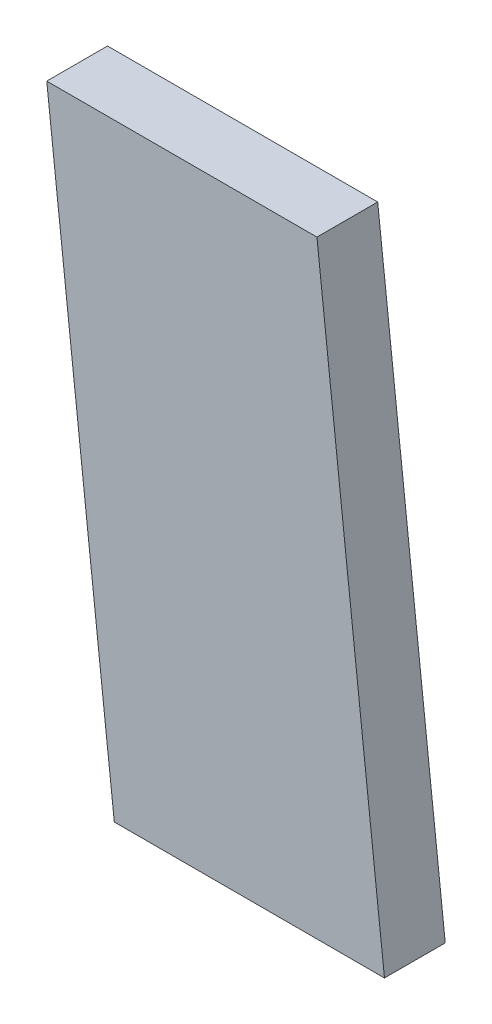
ISO-10303-21;
HEADER;
FILE_DESCRIPTION(('STEP AP214'),'2;1');
FILE_NAME('part.step','',(''),(''),'','','');
FILE_SCHEMA(('AUTOMOTIVE_DESIGN { 1 0 10303 214 1 1 1 1 }'));
ENDSEC;
DATA;
#1=APPLICATION_CONTEXT('core data for automotive mechanical design processes');
#2=APPLICATION_PROTOCOL_DEFINITION('international standard','automotive_design',2000,#1);
#3=PRODUCT_CONTEXT('',#1,'mechanical');
#4=PRODUCT('Part','Part','',(#3));
#5=PRODUCT_RELATED_PRODUCT_CATEGORY('part','',(#4));
#6=PRODUCT_DEFINITION_FORMATION('','',#4);
#7=PRODUCT_DEFINITION_CONTEXT('part definition',#1,'design');
#8=PRODUCT_DEFINITION('design','',#6,#7);
#9=PRODUCT_DEFINITION_SHAPE('','',#8);
#10=(LENGTH_UNIT() NAMED_UNIT(*) SI_UNIT(.MILLI.,.METRE.));
#11=(NAMED_UNIT(*) PLANE_ANGLE_UNIT() SI_UNIT($,.RADIAN.));
#12=(NAMED_UNIT(*) SI_UNIT($,.STERADIAN.) SOLID_ANGLE_UNIT());
#13=UNCERTAINTY_MEASURE_WITH_UNIT(LENGTH_MEASURE(1.E-05),#10,'distance_accuracy_value','');
#14=(GEOMETRIC_REPRESENTATION_CONTEXT(3) GLOBAL_UNCERTAINTY_ASSIGNED_CONTEXT((#13)) GLOBAL_UNIT_ASSIGNED_CONTEXT((#10,
#11,#12)) REPRESENTATION_CONTEXT('',''));
#15=CARTESIAN_POINT('',(0.,0.,0.));
#16=DIRECTION('',(0.,0.,1.));
#17=DIRECTION('',(1.,0.,0.));
#18=AXIS2_PLACEMENT_3D('',#15,#16,#17);
#19=CARTESIAN_POINT('',(1380.,500.,18.));
#20=DIRECTION('',(0.,1.,0.));
#21=DIRECTION('',(0.,0.,1.));
#22=AXIS2_PLACEMENT_3D('',#19,#20,#21);
#23=PLANE('',#22);
#24=DIRECTION('',(1.,0.,0.));
#25=VECTOR('',#24,1.);
#26=CARTESIAN_POINT('',(1380.,500.,0.));
#27=LINE('',#26,#25);
#28=CARTESIAN_POINT('',(1300.,500.,0.));
#29=VERTEX_POINT('',#28);
#30=CARTESIAN_POINT('',(1380.,500.,0.));
#31=VERTEX_POINT('',#30);
#32=EDGE_CURVE('E105',#29,#31,#27,.T.);
#33=ORIENTED_EDGE('',*,*,#32,.T.);
#34=DIRECTION('',(0.,0.,-1.));
#35=VECTOR('',#34,1.);
#36=CARTESIAN_POINT('',(1380.,500.,18.));
#37=LINE('',#36,#35);
#38=CARTESIAN_POINT('',(1380.,500.,18.));
#39=VERTEX_POINT('',#38);
#40=EDGE_CURVE('E11',#39,#31,#37,.T.);
#41=ORIENTED_EDGE('',*,*,#40,.F.);
#42=DIRECTION('',(1.,0.,0.));
#43=VECTOR('',#42,1.);
#44=CARTESIAN_POINT('',(1380.,500.,18.));
#45=LINE('',#44,#43);
#46=CARTESIAN_POINT('',(1300.,500.,18.));
#47=VERTEX_POINT('',#46);
#48=EDGE_CURVE('E89',#47,#39,#45,.T.);
#49=ORIENTED_EDGE('',*,*,#48,.F.);
#50=DIRECTION('',(0.,0.,-1.));
#51=VECTOR('',#50,1.);
#52=CARTESIAN_POINT('',(1300.,500.,18.));
#53=LINE('',#52,#51);
#54=EDGE_CURVE('E97',#47,#29,#53,.T.);
#55=ORIENTED_EDGE('',*,*,#54,.T.);
#56=EDGE_LOOP('',(#33,#41,#49,#55));
#57=FACE_BOUND('',#56,.T.);
#58=ADVANCED_FACE('F39',(#57),#23,.F.);
#59=CARTESIAN_POINT('',(1360.,680.,18.));
#60=DIRECTION('',(-0.993883734673619,-0.110431526074845,0.));
#61=DIRECTION('',(0.110431526074845,-0.993883734673619,0.));
#62=AXIS2_PLACEMENT_3D('',#59,#60,#61);
#63=PLANE('',#62);
#64=DIRECTION('',(-0.110431526074845,0.993883734673619,0.));
#65=VECTOR('',#64,1.);
#66=CARTESIAN_POINT('',(1360.,680.,0.));
#67=LINE('',#66,#65);
#68=CARTESIAN_POINT('',(1360.,680.,0.));
#69=VERTEX_POINT('',#68);
#70=EDGE_CURVE('E92',#31,#69,#67,.T.);
#71=ORIENTED_EDGE('',*,*,#70,.T.);
#72=DIRECTION('',(0.,0.,-1.));
#73=VECTOR('',#72,1.);
#74=CARTESIAN_POINT('',(1360.,680.,18.));
#75=LINE('',#74,#73);
#76=CARTESIAN_POINT('',(1360.,680.,18.));
#77=VERTEX_POINT('',#76);
#78=EDGE_CURVE('E50',#77,#69,#75,.T.);
#79=ORIENTED_EDGE('',*,*,#78,.F.);
#80=DIRECTION('',(-0.110431526074845,0.993883734673619,0.));
#81=VECTOR('',#80,1.);
#82=CARTESIAN_POINT('',(1360.,680.,18.));
#83=LINE('',#82,#81);
#84=EDGE_CURVE('E82',#39,#77,#83,.T.);
#85=ORIENTED_EDGE('',*,*,#84,.F.);
#86=ORIENTED_EDGE('',*,*,#40,.T.);
#87=EDGE_LOOP('',(#71,#79,#85,#86));
#88=FACE_BOUND('',#87,.T.);
#89=ADVANCED_FACE('F93',(#88),#63,.F.);
#90=CARTESIAN_POINT('',(1280.,680.,18.));
#91=DIRECTION('',(0.,-1.,0.));
#92=DIRECTION('',(0.,0.,-1.));
#93=AXIS2_PLACEMENT_3D('',#90,#91,#92);
#94=PLANE('',#93);
#95=DIRECTION('',(-1.,0.,0.));
#96=VECTOR('',#95,1.);
#97=CARTESIAN_POINT('',(1280.,680.,0.));
#98=LINE('',#97,#96);
#99=CARTESIAN_POINT('',(1280.,680.,0.));
#100=VERTEX_POINT('',#99);
#101=EDGE_CURVE('E72',#69,#100,#98,.T.);
#102=ORIENTED_EDGE('',*,*,#101,.T.);
#103=DIRECTION('',(0.,0.,-1.));
#104=VECTOR('',#103,1.);
#105=CARTESIAN_POINT('',(1280.,680.,18.));
#106=LINE('',#105,#104);
#107=CARTESIAN_POINT('',(1280.,680.,18.));
#108=VERTEX_POINT('',#107);
#109=EDGE_CURVE('E94',#108,#100,#106,.T.);
#110=ORIENTED_EDGE('',*,*,#109,.F.);
#111=DIRECTION('',(-1.,0.,0.));
#112=VECTOR('',#111,1.);
#113=CARTESIAN_POINT('',(1280.,680.,18.));
#114=LINE('',#113,#112);
#115=EDGE_CURVE('E88',#77,#108,#114,.T.);
#116=ORIENTED_EDGE('',*,*,#115,.F.);
#117=ORIENTED_EDGE('',*,*,#78,.T.);
#118=EDGE_LOOP('',(#102,#110,#116,#117));
#119=FACE_BOUND('',#118,.T.);
#120=ADVANCED_FACE('F96',(#119),#94,.F.);
#121=CARTESIAN_POINT('',(1300.,500.,18.));
#122=DIRECTION('',(0.993883734673619,0.110431526074847,0.));
#123=DIRECTION('',(-0.110431526074847,0.993883734673619,0.));
#124=AXIS2_PLACEMENT_3D('',#121,#122,#123);
#125=PLANE('',#124);
#126=DIRECTION('',(0.110431526074847,-0.993883734673619,0.));
#127=VECTOR('',#126,1.);
#128=CARTESIAN_POINT('',(1300.,500.,0.));
#129=LINE('',#128,#127);
#130=EDGE_CURVE('E76',#100,#29,#129,.T.);
#131=ORIENTED_EDGE('',*,*,#130,.T.);
#132=ORIENTED_EDGE('',*,*,#54,.F.);
#133=DIRECTION('',(0.110431526074847,-0.993883734673619,0.));
#134=VECTOR('',#133,1.);
#135=CARTESIAN_POINT('',(1300.,500.,18.));
#136=LINE('',#135,#134);
#137=EDGE_CURVE('E54',#108,#47,#136,.T.);
#138=ORIENTED_EDGE('',*,*,#137,.F.);
#139=ORIENTED_EDGE('',*,*,#109,.T.);
#140=EDGE_LOOP('',(#131,#132,#138,#139));
#141=FACE_BOUND('',#140,.T.);
#142=ADVANCED_FACE('F108',(#141),#125,.F.);
#143=CARTESIAN_POINT('',(0.,0.,18.));
#144=DIRECTION('',(0.,0.,-1.));
#145=DIRECTION('',(-1.,0.,0.));
#146=AXIS2_PLACEMENT_3D('',#143,#144,#145);
#147=PLANE('',#146);
#148=ORIENTED_EDGE('',*,*,#48,.T.);
#149=ORIENTED_EDGE('',*,*,#84,.T.);
#150=ORIENTED_EDGE('',*,*,#115,.T.);
#151=ORIENTED_EDGE('',*,*,#137,.T.);
#152=EDGE_LOOP('',(#148,#149,#150,#151));
#153=FACE_BOUND('',#152,.T.);
#154=ADVANCED_FACE('F86',(#153),#147,.F.);
#155=CARTESIAN_POINT('',(0.,0.,0.));
#156=DIRECTION('',(0.,0.,-1.));
#157=DIRECTION('',(-1.,0.,0.));
#158=AXIS2_PLACEMENT_3D('',#155,#156,#157);
#159=PLANE('',#158);
#160=ORIENTED_EDGE('',*,*,#32,.F.);
#161=ORIENTED_EDGE('',*,*,#130,.F.);
#162=ORIENTED_EDGE('',*,*,#101,.F.);
#163=ORIENTED_EDGE('',*,*,#70,.F.);
#164=EDGE_LOOP('',(#160,#161,#162,#163));
#165=FACE_BOUND('',#164,.T.);
#166=ADVANCED_FACE('F115',(#165),#159,.T.);
#167=CLOSED_SHELL('',(#58,#89,#120,#142,#154,#166));
#168=MANIFOLD_SOLID_BREP('B2',#167);
#169=ADVANCED_BREP_SHAPE_REPRESENTATION('',(#18,#168),#14);
#170=SHAPE_DEFINITION_REPRESENTATION(#9,#169);
ENDSEC;
END-ISO-10303-21;
